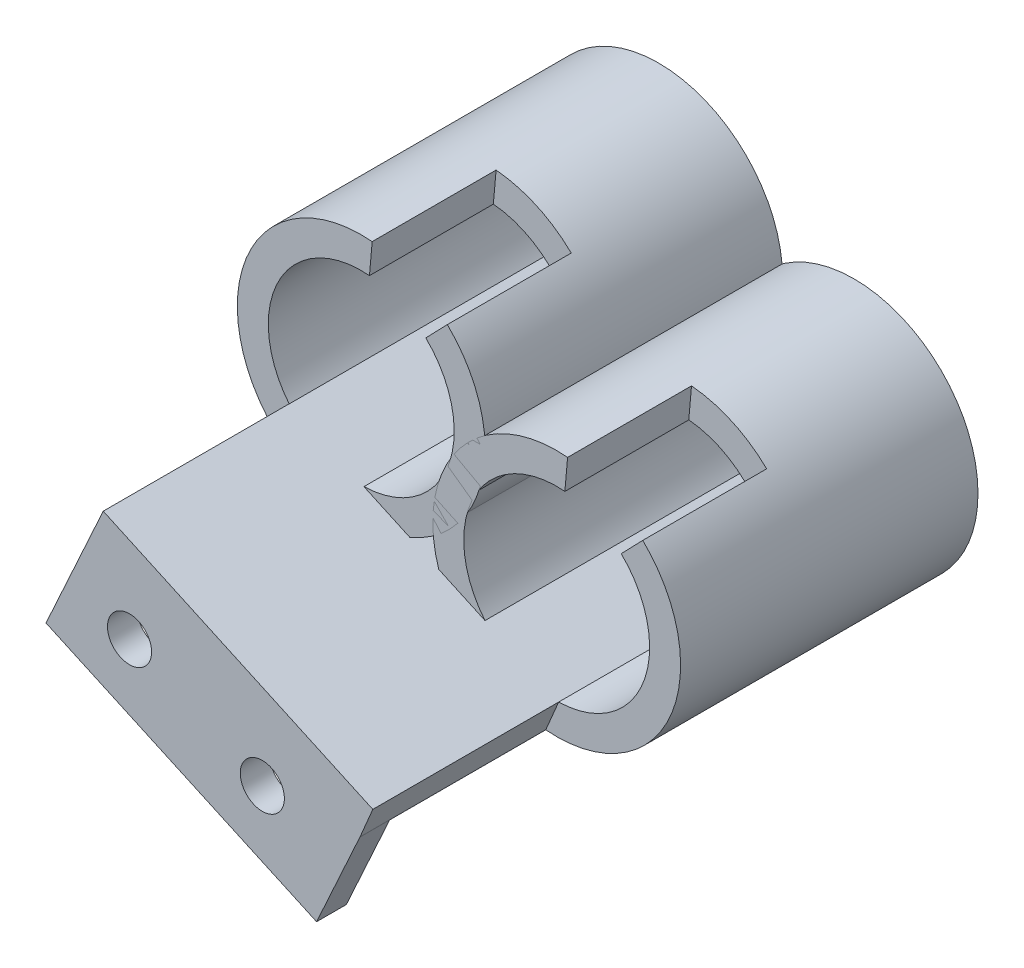
ISO-10303-21;
HEADER;
FILE_DESCRIPTION(('STEP AP214'),'2;1');
FILE_NAME('part.step','',(''),(''),'','','');
FILE_SCHEMA(('AUTOMOTIVE_DESIGN { 1 0 10303 214 1 1 1 1 }'));
ENDSEC;
DATA;
#1=APPLICATION_CONTEXT('core data for automotive mechanical design processes');
#2=APPLICATION_PROTOCOL_DEFINITION('international standard','automotive_design',2000,#1);
#3=PRODUCT_CONTEXT('',#1,'mechanical');
#4=PRODUCT('Part','Part','',(#3));
#5=PRODUCT_RELATED_PRODUCT_CATEGORY('part','',(#4));
#6=PRODUCT_DEFINITION_FORMATION('','',#4);
#7=PRODUCT_DEFINITION_CONTEXT('part definition',#1,'design');
#8=PRODUCT_DEFINITION('design','',#6,#7);
#9=PRODUCT_DEFINITION_SHAPE('','',#8);
#10=(LENGTH_UNIT() NAMED_UNIT(*) SI_UNIT(.MILLI.,.METRE.));
#11=(NAMED_UNIT(*) PLANE_ANGLE_UNIT() SI_UNIT($,.RADIAN.));
#12=(NAMED_UNIT(*) SI_UNIT($,.STERADIAN.) SOLID_ANGLE_UNIT());
#13=UNCERTAINTY_MEASURE_WITH_UNIT(LENGTH_MEASURE(1.E-05),#10,'distance_accuracy_value','');
#14=(GEOMETRIC_REPRESENTATION_CONTEXT(3) GLOBAL_UNCERTAINTY_ASSIGNED_CONTEXT((#13)) GLOBAL_UNIT_ASSIGNED_CONTEXT((#10,
#11,#12)) REPRESENTATION_CONTEXT('',''));
#15=CARTESIAN_POINT('',(0.,0.,0.));
#16=DIRECTION('',(0.,0.,1.));
#17=DIRECTION('',(1.,0.,0.));
#18=AXIS2_PLACEMENT_3D('',#15,#16,#17);
#19=CARTESIAN_POINT('',(15.3328608844258,0.365893564889776,20.9143314535494));
#20=DIRECTION('',(-0.415073445065464,-0.909787906713146,0.));
#21=DIRECTION('',(0.909787906713146,-0.415073445065464,0.));
#22=AXIS2_PLACEMENT_3D('',#19,#20,#21);
#23=PLANE('',#22);
#24=DIRECTION('',(0.,0.,1.));
#25=VECTOR('',#24,1.);
#26=CARTESIAN_POINT('',(15.3328608844258,0.365893564889776,20.9143314535494));
#27=LINE('',#26,#25);
#28=CARTESIAN_POINT('',(15.3328608844258,0.365893564889776,20.9143314535494));
#29=VERTEX_POINT('',#28);
#30=CARTESIAN_POINT('',(15.3328608844258,0.365893564889779,56.1203314535494));
#31=VERTEX_POINT('',#30);
#32=EDGE_CURVE('P0_E11',#29,#31,#27,.T.);
#33=ORIENTED_EDGE('',*,*,#32,.T.);
#34=DIRECTION('',(0.909787906713146,-0.415073445065464,0.));
#35=VECTOR('',#34,1.);
#36=CARTESIAN_POINT('',(-6.50281246817029,10.3280046205645,56.1203314535494));
#37=LINE('',#36,#35);
#38=CARTESIAN_POINT('',(-6.50281246817029,10.3280046205645,56.1203314535494));
#39=VERTEX_POINT('',#38);
#40=EDGE_CURVE('P0_E157',#39,#31,#37,.T.);
#41=ORIENTED_EDGE('',*,*,#40,.F.);
#42=DIRECTION('',(0.,0.,1.));
#43=VECTOR('',#42,1.);
#44=CARTESIAN_POINT('',(-6.50281246817029,10.3280046205645,20.9143314535494));
#45=LINE('',#44,#43);
#46=CARTESIAN_POINT('',(-6.50281246817029,10.3280046205645,20.9143314535494));
#47=VERTEX_POINT('',#46);
#48=EDGE_CURVE('P0_E44',#47,#39,#45,.T.);
#49=ORIENTED_EDGE('',*,*,#48,.F.);
#50=DIRECTION('',(0.909787906713146,-0.415073445065464,0.));
#51=VECTOR('',#50,1.);
#52=CARTESIAN_POINT('',(15.3328608844258,0.365893564889776,20.9143314535494));
#53=LINE('',#52,#51);
#54=EDGE_CURVE('P0_E147',#47,#29,#53,.T.);
#55=ORIENTED_EDGE('',*,*,#54,.T.);
#56=EDGE_LOOP('',(#33,#41,#49,#55));
#57=FACE_BOUND('',#56,.T.);
#58=ADVANCED_FACE('P0_F35',(#57),#23,.T.);
#59=CARTESIAN_POINT('',(15.3328608844258,0.365893564889776,20.9143314535494));
#60=DIRECTION('',(0.908709466234053,-0.41742916282481,0.));
#61=DIRECTION('',(0.41742916282481,0.908709466234053,0.));
#62=AXIS2_PLACEMENT_3D('',#59,#60,#61);
#63=PLANE('',#62);
#64=DIRECTION('',(0.,0.,1.));
#65=VECTOR('',#64,1.);
#66=CARTESIAN_POINT('',(15.3446784619629,0.391619473695926,20.9143314535494));
#67=LINE('',#66,#65);
#68=CARTESIAN_POINT('',(15.3446784619629,0.391619473695926,20.9143314535494));
#69=VERTEX_POINT('',#68);
#70=CARTESIAN_POINT('',(15.3446784619629,0.391619473695926,58.5203314535494));
#71=VERTEX_POINT('',#70);
#72=EDGE_CURVE('P0_E148',#69,#71,#67,.T.);
#73=ORIENTED_EDGE('',*,*,#72,.T.);
#74=DIRECTION('',(0.41742916282481,0.908709466234053,0.));
#75=VECTOR('',#74,1.);
#76=CARTESIAN_POINT('',(15.3328608844258,0.365893564889776,58.5203314535494));
#77=LINE('',#76,#75);
#78=CARTESIAN_POINT('',(15.3328608844258,0.365893564889776,58.5203314535494));
#79=VERTEX_POINT('',#78);
#80=EDGE_CURVE('P0_E121',#79,#71,#77,.T.);
#81=ORIENTED_EDGE('',*,*,#80,.F.);
#82=DIRECTION('',(0.,0.,1.));
#83=VECTOR('',#82,1.);
#84=CARTESIAN_POINT('',(15.3328608844258,0.365893564889779,58.5203314535494));
#85=LINE('',#84,#83);
#86=EDGE_CURVE('P0_E118',#31,#79,#85,.T.);
#87=ORIENTED_EDGE('',*,*,#86,.F.);
#88=ORIENTED_EDGE('',*,*,#32,.F.);
#89=DIRECTION('',(0.41742916282481,0.908709466234053,0.));
#90=VECTOR('',#89,1.);
#91=CARTESIAN_POINT('',(15.3328608844258,0.365893564889776,20.9143314535494));
#92=LINE('',#91,#90);
#93=EDGE_CURVE('P0_E137',#29,#69,#92,.T.);
#94=ORIENTED_EDGE('',*,*,#93,.T.);
#95=EDGE_LOOP('',(#73,#81,#87,#88,#94));
#96=FACE_BOUND('',#95,.T.);
#97=ADVANCED_FACE('P0_F37',(#96),#63,.T.);
#98=CARTESIAN_POINT('',(-6.50281246817029,10.3280046205645,20.9143314535494));
#99=DIRECTION('',(-0.909787906713146,0.415073445065464,0.));
#100=DIRECTION('',(-0.415073445065464,-0.909787906713146,0.));
#101=AXIS2_PLACEMENT_3D('',#98,#99,#100);
#102=PLANE('',#101);
#103=ORIENTED_EDGE('',*,*,#48,.T.);
#104=DIRECTION('',(0.415073445065464,0.909787906713146,0.));
#105=VECTOR('',#104,1.);
#106=CARTESIAN_POINT('',(-9.9977308756215,2.66759044603984,56.1203314535494));
#107=LINE('',#106,#105);
#108=CARTESIAN_POINT('',(-9.9977308756215,2.66759044603984,56.1203314535494));
#109=VERTEX_POINT('',#108);
#110=EDGE_CURVE('P0_E103',#109,#39,#107,.T.);
#111=ORIENTED_EDGE('',*,*,#110,.F.);
#112=DIRECTION('',(0.,0.,-1.));
#113=VECTOR('',#112,1.);
#114=CARTESIAN_POINT('',(-9.9977308756215,2.66759044603984,58.5203314535494));
#115=LINE('',#114,#113);
#116=CARTESIAN_POINT('',(-9.9977308756215,2.66759044603984,58.5203314535494));
#117=VERTEX_POINT('',#116);
#118=EDGE_CURVE('P0_E109',#117,#109,#115,.T.);
#119=ORIENTED_EDGE('',*,*,#118,.F.);
#120=DIRECTION('',(-0.415073445065464,-0.909787906713146,0.));
#121=VECTOR('',#120,1.);
#122=CARTESIAN_POINT('',(-6.50281246817029,10.3280046205645,58.5203314535494));
#123=LINE('',#122,#121);
#124=CARTESIAN_POINT('',(-5.37815341438028,12.7931134307709,58.5203314535494));
#125=VERTEX_POINT('',#124);
#126=EDGE_CURVE('P0_E135',#125,#117,#123,.T.);
#127=ORIENTED_EDGE('',*,*,#126,.F.);
#128=DIRECTION('',(0.,0.,1.));
#129=VECTOR('',#128,1.);
#130=CARTESIAN_POINT('',(-5.37815341438028,12.7931134307709,20.9143314535494));
#131=LINE('',#130,#129);
#132=CARTESIAN_POINT('',(-5.37815341438028,12.7931134307709,20.9143314535494));
#133=VERTEX_POINT('',#132);
#134=EDGE_CURVE('P0_E151',#133,#125,#131,.T.);
#135=ORIENTED_EDGE('',*,*,#134,.F.);
#136=DIRECTION('',(-0.415073445065464,-0.909787906713146,0.));
#137=VECTOR('',#136,1.);
#138=CARTESIAN_POINT('',(-6.50281246817029,10.3280046205645,20.9143314535494));
#139=LINE('',#138,#137);
#140=EDGE_CURVE('P0_E145',#133,#47,#139,.T.);
#141=ORIENTED_EDGE('',*,*,#140,.T.);
#142=EDGE_LOOP('',(#103,#111,#119,#127,#135,#141));
#143=FACE_BOUND('',#142,.T.);
#144=ADVANCED_FACE('P0_F120',(#143),#102,.T.);
#145=CARTESIAN_POINT('',(-5.37815341438028,12.7931134307709,20.9143314535494));
#146=DIRECTION('',(0.416449611726263,0.909158798501695,0.));
#147=DIRECTION('',(-0.909158798501695,0.416449611726263,0.));
#148=AXIS2_PLACEMENT_3D('',#145,#146,#147);
#149=PLANE('',#148);
#150=ORIENTED_EDGE('',*,*,#134,.T.);
#151=DIRECTION('',(-0.909158798501695,0.416449611726263,0.));
#152=VECTOR('',#151,1.);
#153=CARTESIAN_POINT('',(-5.37815341438028,12.7931134307709,58.5203314535494));
#154=LINE('',#153,#152);
#155=CARTESIAN_POINT('',(16.3751761156052,2.82877535094867,58.5203314535494));
#156=VERTEX_POINT('',#155);
#157=EDGE_CURVE('P0_E132',#156,#125,#154,.T.);
#158=ORIENTED_EDGE('',*,*,#157,.F.);
#159=DIRECTION('',(0.,0.,1.));
#160=VECTOR('',#159,1.);
#161=CARTESIAN_POINT('',(16.3751761156052,2.82877535094867,20.9143314535494));
#162=LINE('',#161,#160);
#163=CARTESIAN_POINT('',(16.3751761156052,2.82877535094867,20.9143314535494));
#164=VERTEX_POINT('',#163);
#165=EDGE_CURVE('P0_E153',#164,#156,#162,.T.);
#166=ORIENTED_EDGE('',*,*,#165,.F.);
#167=DIRECTION('',(-0.909158798501695,0.416449611726263,0.));
#168=VECTOR('',#167,1.);
#169=CARTESIAN_POINT('',(-5.37815341438028,12.7931134307709,20.9143314535494));
#170=LINE('',#169,#168);
#171=EDGE_CURVE('P0_E142',#164,#133,#170,.T.);
#172=ORIENTED_EDGE('',*,*,#171,.T.);
#173=EDGE_LOOP('',(#150,#158,#166,#172));
#174=FACE_BOUND('',#173,.T.);
#175=ADVANCED_FACE('P0_F185',(#174),#149,.T.);
#176=CARTESIAN_POINT('',(15.3446784619629,0.391619473695926,20.9143314535494));
#177=DIRECTION('',(0.921049515676657,-0.389445489987746,0.));
#178=DIRECTION('',(0.389445489987746,0.921049515676657,0.));
#179=AXIS2_PLACEMENT_3D('',#176,#177,#178);
#180=PLANE('',#179);
#181=ORIENTED_EDGE('',*,*,#165,.T.);
#182=DIRECTION('',(0.389445489987746,0.921049515676657,0.));
#183=VECTOR('',#182,1.);
#184=CARTESIAN_POINT('',(15.3446784619629,0.391619473695926,58.5203314535494));
#185=LINE('',#184,#183);
#186=EDGE_CURVE('P0_E124',#71,#156,#185,.T.);
#187=ORIENTED_EDGE('',*,*,#186,.F.);
#188=ORIENTED_EDGE('',*,*,#72,.F.);
#189=DIRECTION('',(0.389445489987746,0.921049515676657,0.));
#190=VECTOR('',#189,1.);
#191=CARTESIAN_POINT('',(15.3446784619629,0.391619473695926,20.9143314535494));
#192=LINE('',#191,#190);
#193=EDGE_CURVE('P0_E139',#69,#164,#192,.T.);
#194=ORIENTED_EDGE('',*,*,#193,.T.);
#195=EDGE_LOOP('',(#181,#187,#188,#194));
#196=FACE_BOUND('',#195,.T.);
#197=ADVANCED_FACE('P0_F182',(#196),#180,.T.);
#198=CARTESIAN_POINT('',(0.,0.,20.9143314535494));
#199=DIRECTION('',(0.,0.,-1.));
#200=DIRECTION('',(-1.,0.,0.));
#201=AXIS2_PLACEMENT_3D('',#198,#199,#200);
#202=PLANE('',#201);
#203=ORIENTED_EDGE('',*,*,#93,.F.);
#204=ORIENTED_EDGE('',*,*,#54,.F.);
#205=ORIENTED_EDGE('',*,*,#140,.F.);
#206=ORIENTED_EDGE('',*,*,#171,.F.);
#207=ORIENTED_EDGE('',*,*,#193,.F.);
#208=EDGE_LOOP('',(#203,#204,#205,#206,#207));
#209=FACE_BOUND('',#208,.T.);
#210=ADVANCED_FACE('P0_F190',(#209),#202,.T.);
#211=CARTESIAN_POINT('',(0.,0.,58.5203314535494));
#212=DIRECTION('',(0.,0.,-1.));
#213=DIRECTION('',(-1.,0.,0.));
#214=AXIS2_PLACEMENT_3D('',#211,#212,#213);
#215=PLANE('',#214);
#216=CARTESIAN_POINT('',(-3.25811638908594,4.90169905713775,58.5203314535494));
#217=DIRECTION('',(0.,0.,1.));
#218=DIRECTION('',(1.,0.,0.));
#219=AXIS2_PLACEMENT_3D('',#216,#217,#218);
#220=CIRCLE('',#219,1.78);
#221=CARTESIAN_POINT('',(-1.47811638908594,4.90169905713775,58.5203314535494));
#222=VERTEX_POINT('',#221);
#223=EDGE_CURVE('P0_E167',#222,#222,#220,.T.);
#224=ORIENTED_EDGE('',*,*,#223,.F.);
#225=EDGE_LOOP('',(#224));
#226=FACE_BOUND('',#225,.T.);
#227=CARTESIAN_POINT('',(7.45924455546138,0.0121067725637695,58.5203314535494));
#228=DIRECTION('',(0.,0.,1.));
#229=DIRECTION('',(1.,0.,0.));
#230=AXIS2_PLACEMENT_3D('',#227,#228,#229);
#231=CIRCLE('',#230,1.78);
#232=CARTESIAN_POINT('',(9.23924455546138,0.0121067725637695,58.5203314535494));
#233=VERTEX_POINT('',#232);
#234=EDGE_CURVE('P0_E158',#233,#233,#231,.T.);
#235=ORIENTED_EDGE('',*,*,#234,.F.);
#236=EDGE_LOOP('',(#235));
#237=FACE_BOUND('',#236,.T.);
#238=ORIENTED_EDGE('',*,*,#80,.T.);
#239=ORIENTED_EDGE('',*,*,#186,.T.);
#240=ORIENTED_EDGE('',*,*,#157,.T.);
#241=ORIENTED_EDGE('',*,*,#126,.T.);
#242=DIRECTION('',(-0.909787906713146,0.415073445065464,0.));
#243=VECTOR('',#242,1.);
#244=CARTESIAN_POINT('',(-9.9977308756215,2.66759044603984,58.5203314535494));
#245=LINE('',#244,#243);
#246=CARTESIAN_POINT('',(11.8379424769746,-7.29452060963491,58.5203314535494));
#247=VERTEX_POINT('',#246);
#248=EDGE_CURVE('P0_E115',#247,#117,#245,.T.);
#249=ORIENTED_EDGE('',*,*,#248,.F.);
#250=DIRECTION('',(0.415073445065464,0.909787906713146,0.));
#251=VECTOR('',#250,1.);
#252=CARTESIAN_POINT('',(11.8379424769746,-7.29452060963491,58.5203314535494));
#253=LINE('',#252,#251);
#254=EDGE_CURVE('P0_E126',#247,#79,#253,.T.);
#255=ORIENTED_EDGE('',*,*,#254,.T.);
#256=EDGE_LOOP('',(#238,#239,#240,#241,#249,#255));
#257=FACE_BOUND('',#256,.T.);
#258=ADVANCED_FACE('P0_F175',(#226,#237,#257),#215,.F.);
#259=CARTESIAN_POINT('',(-9.9977308756215,2.66759044603984,56.1203314535494));
#260=DIRECTION('',(0.,0.,1.));
#261=DIRECTION('',(1.,0.,0.));
#262=AXIS2_PLACEMENT_3D('',#259,#260,#261);
#263=PLANE('',#262);
#264=CARTESIAN_POINT('',(-3.25811638908594,4.90169905713775,56.1203314535494));
#265=DIRECTION('',(0.,0.,1.));
#266=DIRECTION('',(1.,0.,0.));
#267=AXIS2_PLACEMENT_3D('',#264,#265,#266);
#268=CIRCLE('',#267,1.78);
#269=CARTESIAN_POINT('',(-1.47811638908594,4.90169905713775,56.1203314535494));
#270=VERTEX_POINT('',#269);
#271=EDGE_CURVE('P0_E39',#270,#270,#268,.T.);
#272=ORIENTED_EDGE('',*,*,#271,.T.);
#273=EDGE_LOOP('',(#272));
#274=FACE_BOUND('',#273,.T.);
#275=CARTESIAN_POINT('',(7.45924455546138,0.0121067725637695,56.1203314535494));
#276=DIRECTION('',(0.,0.,1.));
#277=DIRECTION('',(1.,0.,0.));
#278=AXIS2_PLACEMENT_3D('',#275,#276,#277);
#279=CIRCLE('',#278,1.78);
#280=CARTESIAN_POINT('',(9.23924455546138,0.0121067725637695,56.1203314535494));
#281=VERTEX_POINT('',#280);
#282=EDGE_CURVE('P0_E155',#281,#281,#279,.T.);
#283=ORIENTED_EDGE('',*,*,#282,.T.);
#284=EDGE_LOOP('',(#283));
#285=FACE_BOUND('',#284,.T.);
#286=ORIENTED_EDGE('',*,*,#40,.T.);
#287=DIRECTION('',(0.415073445065464,0.909787906713146,0.));
#288=VECTOR('',#287,1.);
#289=CARTESIAN_POINT('',(11.8379424769746,-7.29452060963491,56.1203314535494));
#290=LINE('',#289,#288);
#291=CARTESIAN_POINT('',(11.8379424769746,-7.29452060963491,56.1203314535494));
#292=VERTEX_POINT('',#291);
#293=EDGE_CURVE('P0_E105',#292,#31,#290,.T.);
#294=ORIENTED_EDGE('',*,*,#293,.F.);
#295=DIRECTION('',(0.909787906713146,-0.415073445065464,0.));
#296=VECTOR('',#295,1.);
#297=CARTESIAN_POINT('',(-9.9977308756215,2.66759044603984,56.1203314535494));
#298=LINE('',#297,#296);
#299=EDGE_CURVE('P0_E99',#109,#292,#298,.T.);
#300=ORIENTED_EDGE('',*,*,#299,.F.);
#301=ORIENTED_EDGE('',*,*,#110,.T.);
#302=EDGE_LOOP('',(#286,#294,#300,#301));
#303=FACE_BOUND('',#302,.T.);
#304=ADVANCED_FACE('P0_F101',(#274,#285,#303),#263,.F.);
#305=CARTESIAN_POINT('',(11.8379424769746,-7.29452060963491,58.5203314535494));
#306=DIRECTION('',(-0.909787906713146,0.415073445065464,0.));
#307=DIRECTION('',(-0.415073445065464,-0.909787906713146,0.));
#308=AXIS2_PLACEMENT_3D('',#305,#306,#307);
#309=PLANE('',#308);
#310=ORIENTED_EDGE('',*,*,#86,.T.);
#311=ORIENTED_EDGE('',*,*,#254,.F.);
#312=DIRECTION('',(0.,0.,1.));
#313=VECTOR('',#312,1.);
#314=CARTESIAN_POINT('',(11.8379424769746,-7.29452060963491,58.5203314535494));
#315=LINE('',#314,#313);
#316=EDGE_CURVE('P0_E108',#292,#247,#315,.T.);
#317=ORIENTED_EDGE('',*,*,#316,.F.);
#318=ORIENTED_EDGE('',*,*,#293,.T.);
#319=EDGE_LOOP('',(#310,#311,#317,#318));
#320=FACE_BOUND('',#319,.T.);
#321=ADVANCED_FACE('P0_F178',(#320),#309,.F.);
#322=CARTESIAN_POINT('',(-0.715109728756649,-1.56742906810891,0.));
#323=DIRECTION('',(-0.415073445065464,-0.909787906713146,0.));
#324=DIRECTION('',(0.909787906713146,-0.415073445065464,0.));
#325=AXIS2_PLACEMENT_3D('',#322,#323,#324);
#326=PLANE('',#325);
#327=ORIENTED_EDGE('',*,*,#118,.T.);
#328=ORIENTED_EDGE('',*,*,#299,.T.);
#329=ORIENTED_EDGE('',*,*,#316,.T.);
#330=ORIENTED_EDGE('',*,*,#248,.T.);
#331=EDGE_LOOP('',(#327,#328,#329,#330));
#332=FACE_BOUND('',#331,.T.);
#333=ADVANCED_FACE('P0_F113',(#332),#326,.T.);
#334=CARTESIAN_POINT('',(7.45924455546138,0.0121067725637695,50.1003314535494));
#335=DIRECTION('',(0.,0.,1.));
#336=DIRECTION('',(1.,0.,0.));
#337=AXIS2_PLACEMENT_3D('',#334,#335,#336);
#338=CYLINDRICAL_SURFACE('',#337,1.78);
#339=ORIENTED_EDGE('',*,*,#234,.T.);
#340=EDGE_LOOP('',(#339));
#341=FACE_BOUND('',#340,.T.);
#342=ORIENTED_EDGE('',*,*,#282,.F.);
#343=EDGE_LOOP('',(#342));
#344=FACE_BOUND('',#343,.T.);
#345=ADVANCED_FACE('P0_F222',(#341,#344),#338,.F.);
#346=CARTESIAN_POINT('',(-3.25811638908594,4.90169905713775,50.1003314535494));
#347=DIRECTION('',(0.,0.,1.));
#348=DIRECTION('',(1.,0.,0.));
#349=AXIS2_PLACEMENT_3D('',#346,#347,#348);
#350=CYLINDRICAL_SURFACE('',#349,1.78);
#351=ORIENTED_EDGE('',*,*,#223,.T.);
#352=EDGE_LOOP('',(#351));
#353=FACE_BOUND('',#352,.T.);
#354=ORIENTED_EDGE('',*,*,#271,.F.);
#355=EDGE_LOOP('',(#354));
#356=FACE_BOUND('',#355,.T.);
#357=ADVANCED_FACE('P0_F225',(#353,#356),#350,.F.);
#358=CLOSED_SHELL('',(#58,#97,#144,#175,#197,#210,#258,#304,#321,#333,#345,#357));
#359=MANIFOLD_SOLID_BREP('P0_B2',#358);
#360=CARTESIAN_POINT('',(16.2135844979987,10.3270343588197,21.5203314535494));
#361=DIRECTION('',(0.,0.,-1.));
#362=DIRECTION('',(-1.,0.,0.));
#363=AXIS2_PLACEMENT_3D('',#360,#361,#362);
#364=CYLINDRICAL_SURFACE('',#363,3.285);
#365=CARTESIAN_POINT('',(16.2135844979987,10.3270343588197,21.5203314535494));
#366=DIRECTION('',(0.,0.,1.));
#367=DIRECTION('',(1.,0.,0.));
#368=AXIS2_PLACEMENT_3D('',#365,#366,#367);
#369=CIRCLE('',#368,3.285);
#370=CARTESIAN_POINT('',(19.4985844979987,10.3270343588197,21.5203314535494));
#371=VERTEX_POINT('',#370);
#372=EDGE_CURVE('P1_E13',#371,#371,#369,.T.);
#373=ORIENTED_EDGE('',*,*,#372,.T.);
#374=EDGE_LOOP('',(#373));
#375=FACE_BOUND('',#374,.T.);
#376=CARTESIAN_POINT('',(16.2135844979987,10.3270343588197,19.5203314535494));
#377=DIRECTION('',(0.,0.,1.));
#378=DIRECTION('',(1.,0.,0.));
#379=AXIS2_PLACEMENT_3D('',#376,#377,#378);
#380=CIRCLE('',#379,3.285);
#381=CARTESIAN_POINT('',(19.4985844979987,10.3270343588197,19.5203314535494));
#382=VERTEX_POINT('',#381);
#383=EDGE_CURVE('P1_E30',#382,#382,#380,.T.);
#384=ORIENTED_EDGE('',*,*,#383,.F.);
#385=EDGE_LOOP('',(#384));
#386=FACE_BOUND('',#385,.T.);
#387=ADVANCED_FACE('P1_F24',(#375,#386),#364,.F.);
#388=CARTESIAN_POINT('',(16.2135844979987,10.3270343588197,19.5203314535494));
#389=DIRECTION('',(0.,0.,1.));
#390=DIRECTION('',(1.,0.,0.));
#391=AXIS2_PLACEMENT_3D('',#388,#389,#390);
#392=PLANE('',#391);
#393=ORIENTED_EDGE('',*,*,#383,.T.);
#394=EDGE_LOOP('',(#393));
#395=FACE_BOUND('',#394,.T.);
#396=CARTESIAN_POINT('',(16.2135844979987,10.3270343588197,19.5203314535494));
#397=DIRECTION('',(0.,0.,1.));
#398=DIRECTION('',(1.,0.,0.));
#399=AXIS2_PLACEMENT_3D('',#396,#397,#398);
#400=CIRCLE('',#399,10.);
#401=CARTESIAN_POINT('',(26.2135844979987,10.3270343588197,19.5203314535494));
#402=VERTEX_POINT('',#401);
#403=EDGE_CURVE('P1_E149',#402,#402,#400,.T.);
#404=ORIENTED_EDGE('',*,*,#403,.F.);
#405=EDGE_LOOP('',(#404));
#406=FACE_BOUND('',#405,.T.);
#407=ADVANCED_FACE('P1_F168',(#395,#406),#392,.F.);
#408=CARTESIAN_POINT('',(16.2135844979987,10.3270343588197,43.5203314535494));
#409=DIRECTION('',(0.996114079392994,-0.0880723613572865,0.));
#410=DIRECTION('',(0.0880723613572865,0.996114079392994,0.));
#411=AXIS2_PLACEMENT_3D('',#408,#409,#410);
#412=PLANE('',#411);
#413=DIRECTION('',(-0.0880723613572865,-0.996114079392994,0.));
#414=VECTOR('',#413,1.);
#415=CARTESIAN_POINT('',(16.2135844979987,10.3270343588197,33.5203314535494));
#416=LINE('',#415,#414);
#417=CARTESIAN_POINT('',(15.553041787819,2.85617876337226,33.5203314535494));
#418=VERTEX_POINT('',#417);
#419=CARTESIAN_POINT('',(15.3328608844258,0.365893564889776,33.5203314535494));
#420=VERTEX_POINT('',#419);
#421=EDGE_CURVE('P1_E136',#418,#420,#416,.T.);
#422=ORIENTED_EDGE('',*,*,#421,.T.);
#423=DIRECTION('',(0.,0.,-1.));
#424=VECTOR('',#423,1.);
#425=CARTESIAN_POINT('',(15.3328608844258,0.365893564889776,43.5203314535494));
#426=LINE('',#425,#424);
#427=CARTESIAN_POINT('',(15.3328608844258,0.365893564889776,43.5203314535494));
#428=VERTEX_POINT('',#427);
#429=EDGE_CURVE('P1_E105',#428,#420,#426,.T.);
#430=ORIENTED_EDGE('',*,*,#429,.F.);
#431=DIRECTION('',(-0.0880723613572865,-0.996114079392994,0.));
#432=VECTOR('',#431,1.);
#433=CARTESIAN_POINT('',(16.2135844979987,10.3270343588197,43.5203314535494));
#434=LINE('',#433,#432);
#435=CARTESIAN_POINT('',(15.553041787819,2.85617876337226,43.5203314535494));
#436=VERTEX_POINT('',#435);
#437=EDGE_CURVE('P1_E88',#436,#428,#434,.T.);
#438=ORIENTED_EDGE('',*,*,#437,.F.);
#439=DIRECTION('',(0.,0.,-1.));
#440=VECTOR('',#439,1.);
#441=CARTESIAN_POINT('',(15.553041787819,2.85617876337226,43.5203314535494));
#442=LINE('',#441,#440);
#443=EDGE_CURVE('P1_E102',#436,#418,#442,.T.);
#444=ORIENTED_EDGE('',*,*,#443,.T.);
#445=EDGE_LOOP('',(#422,#430,#438,#444));
#446=FACE_BOUND('',#445,.T.);
#447=ADVANCED_FACE('P1_F101',(#446),#412,.F.);
#448=CARTESIAN_POINT('',(16.2135844979987,10.3270343588197,43.5203314535494));
#449=DIRECTION('',(-0.719398449349351,0.694597632499383,0.));
#450=DIRECTION('',(-0.694597632499383,-0.719398449349351,0.));
#451=AXIS2_PLACEMENT_3D('',#448,#449,#450);
#452=PLANE('',#451);
#453=DIRECTION('',(0.694597632499383,0.719398449349351,0.));
#454=VECTOR('',#453,1.);
#455=CARTESIAN_POINT('',(16.2135844979987,10.3270343588197,33.5203314535494));
#456=LINE('',#455,#454);
#457=CARTESIAN_POINT('',(21.4230667417441,15.7225227289398,33.5203314535494));
#458=VERTEX_POINT('',#457);
#459=CARTESIAN_POINT('',(23.1595608229925,17.5210188523132,33.5203314535494));
#460=VERTEX_POINT('',#459);
#461=EDGE_CURVE('P1_E161',#458,#460,#456,.T.);
#462=ORIENTED_EDGE('',*,*,#461,.F.);
#463=DIRECTION('',(0.,0.,-1.));
#464=VECTOR('',#463,1.);
#465=CARTESIAN_POINT('',(21.4230667417441,15.7225227289398,43.5203314535494));
#466=LINE('',#465,#464);
#467=CARTESIAN_POINT('',(21.4230667417441,15.7225227289398,43.5203314535494));
#468=VERTEX_POINT('',#467);
#469=EDGE_CURVE('P1_E112',#468,#458,#466,.T.);
#470=ORIENTED_EDGE('',*,*,#469,.F.);
#471=DIRECTION('',(0.694597632499383,0.719398449349351,0.));
#472=VECTOR('',#471,1.);
#473=CARTESIAN_POINT('',(16.2135844979987,10.3270343588197,43.5203314535494));
#474=LINE('',#473,#472);
#475=CARTESIAN_POINT('',(23.1595608229925,17.5210188523132,43.5203314535494));
#476=VERTEX_POINT('',#475);
#477=EDGE_CURVE('P1_E91',#468,#476,#474,.T.);
#478=ORIENTED_EDGE('',*,*,#477,.T.);
#479=DIRECTION('',(0.,0.,-1.));
#480=VECTOR('',#479,1.);
#481=CARTESIAN_POINT('',(23.1595608229925,17.5210188523132,43.5203314535494));
#482=LINE('',#481,#480);
#483=EDGE_CURVE('P1_E144',#476,#460,#482,.T.);
#484=ORIENTED_EDGE('',*,*,#483,.T.);
#485=EDGE_LOOP('',(#462,#470,#478,#484));
#486=FACE_BOUND('',#485,.T.);
#487=ADVANCED_FACE('P1_F181',(#486),#452,.T.);
#488=CARTESIAN_POINT('',(16.2135844979987,10.3270343588197,33.5203314535494));
#489=DIRECTION('',(0.,0.,1.));
#490=DIRECTION('',(1.,0.,0.));
#491=AXIS2_PLACEMENT_3D('',#488,#489,#490);
#492=PLANE('',#491);
#493=ORIENTED_EDGE('',*,*,#461,.T.);
#494=CARTESIAN_POINT('',(16.2135844979987,10.3270343588197,33.5203314535494));
#495=DIRECTION('',(0.,0.,1.));
#496=DIRECTION('',(1.,0.,0.));
#497=AXIS2_PLACEMENT_3D('',#494,#495,#496);
#498=CIRCLE('',#497,10.);
#499=CARTESIAN_POINT('',(17.0943081115716,20.2881751527497,33.5203314535494));
#500=VERTEX_POINT('',#499);
#501=EDGE_CURVE('P1_E37',#460,#500,#498,.T.);
#502=ORIENTED_EDGE('',*,*,#501,.T.);
#503=DIRECTION('',(0.0880723613572865,0.996114079392994,0.));
#504=VECTOR('',#503,1.);
#505=CARTESIAN_POINT('',(16.2135844979987,10.3270343588197,33.5203314535494));
#506=LINE('',#505,#504);
#507=CARTESIAN_POINT('',(16.8741272081783,17.7978899542672,33.5203314535494));
#508=VERTEX_POINT('',#507);
#509=EDGE_CURVE('P1_E158',#508,#500,#506,.T.);
#510=ORIENTED_EDGE('',*,*,#509,.F.);
#511=CARTESIAN_POINT('',(16.2135844979987,10.3270343588197,33.5203314535494));
#512=DIRECTION('',(0.,0.,1.));
#513=DIRECTION('',(1.,0.,0.));
#514=AXIS2_PLACEMENT_3D('',#511,#512,#513);
#515=CIRCLE('',#514,7.5);
#516=EDGE_CURVE('P1_E114',#458,#508,#515,.T.);
#517=ORIENTED_EDGE('',*,*,#516,.F.);
#518=EDGE_LOOP('',(#493,#502,#510,#517));
#519=FACE_BOUND('',#518,.T.);
#520=ADVANCED_FACE('P1_F186',(#519),#492,.T.);
#521=CARTESIAN_POINT('',(16.2135844979987,10.3270343588197,43.5203314535494));
#522=DIRECTION('',(-0.996114079392994,0.0880723613572865,0.));
#523=DIRECTION('',(-0.0880723613572865,-0.996114079392994,0.));
#524=AXIS2_PLACEMENT_3D('',#521,#522,#523);
#525=PLANE('',#524);
#526=ORIENTED_EDGE('',*,*,#509,.T.);
#527=DIRECTION('',(0.,0.,-1.));
#528=VECTOR('',#527,1.);
#529=CARTESIAN_POINT('',(17.0943081115716,20.2881751527497,43.5203314535494));
#530=LINE('',#529,#528);
#531=CARTESIAN_POINT('',(17.0943081115716,20.2881751527497,43.5203314535494));
#532=VERTEX_POINT('',#531);
#533=EDGE_CURVE('P1_E42',#532,#500,#530,.T.);
#534=ORIENTED_EDGE('',*,*,#533,.F.);
#535=DIRECTION('',(0.0880723613572865,0.996114079392994,0.));
#536=VECTOR('',#535,1.);
#537=CARTESIAN_POINT('',(16.2135844979987,10.3270343588197,43.5203314535494));
#538=LINE('',#537,#536);
#539=CARTESIAN_POINT('',(16.8741272081783,17.7978899542672,43.5203314535494));
#540=VERTEX_POINT('',#539);
#541=EDGE_CURVE('P1_E155',#540,#532,#538,.T.);
#542=ORIENTED_EDGE('',*,*,#541,.F.);
#543=DIRECTION('',(0.,0.,-1.));
#544=VECTOR('',#543,1.);
#545=CARTESIAN_POINT('',(16.8741272081783,17.7978899542672,43.5203314535494));
#546=LINE('',#545,#544);
#547=EDGE_CURVE('P1_E122',#540,#508,#546,.T.);
#548=ORIENTED_EDGE('',*,*,#547,.T.);
#549=EDGE_LOOP('',(#526,#534,#542,#548));
#550=FACE_BOUND('',#549,.T.);
#551=ADVANCED_FACE('P1_F188',(#550),#525,.F.);
#552=CARTESIAN_POINT('',(16.2135844979987,10.3270343588197,43.5203314535494));
#553=DIRECTION('',(0.,0.,1.));
#554=DIRECTION('',(1.,0.,0.));
#555=AXIS2_PLACEMENT_3D('',#552,#553,#554);
#556=PLANE('',#555);
#557=CARTESIAN_POINT('',(16.2135844979987,10.3270343588197,43.5203314535494));
#558=DIRECTION('',(0.,0.,1.));
#559=DIRECTION('',(1.,0.,0.));
#560=AXIS2_PLACEMENT_3D('',#557,#558,#559);
#561=CIRCLE('',#560,7.5);
#562=CARTESIAN_POINT('',(11.0041022542533,4.93154598869958,43.5203314535494));
#563=VERTEX_POINT('',#562);
#564=EDGE_CURVE('P1_E125',#563,#540,#561,.F.);
#565=ORIENTED_EDGE('',*,*,#564,.T.);
#566=ORIENTED_EDGE('',*,*,#541,.T.);
#567=CARTESIAN_POINT('',(16.2135844979987,10.3270343588197,43.5203314535494));
#568=DIRECTION('',(0.,0.,1.));
#569=DIRECTION('',(1.,0.,0.));
#570=AXIS2_PLACEMENT_3D('',#567,#568,#569);
#571=CIRCLE('',#570,10.);
#572=CARTESIAN_POINT('',(9.26760817300485,3.1330498653262,43.5203314535494));
#573=VERTEX_POINT('',#572);
#574=EDGE_CURVE('P1_E333',#532,#573,#571,.T.);
#575=ORIENTED_EDGE('',*,*,#574,.T.);
#576=DIRECTION('',(0.694597632499383,0.719398449349352,0.));
#577=VECTOR('',#576,1.);
#578=CARTESIAN_POINT('',(16.2135844979987,10.3270343588197,43.5203314535494));
#579=LINE('',#578,#577);
#580=EDGE_CURVE('P1_E152',#573,#563,#579,.T.);
#581=ORIENTED_EDGE('',*,*,#580,.T.);
#582=EDGE_LOOP('',(#565,#566,#575,#581));
#583=FACE_BOUND('',#582,.T.);
#584=ADVANCED_FACE('P1_F191',(#583),#556,.T.);
#585=CARTESIAN_POINT('',(16.2135844979987,10.3270343588197,43.5203314535494));
#586=DIRECTION('',(-0.719398449349352,0.694597632499383,0.));
#587=DIRECTION('',(-0.694597632499383,-0.719398449349352,0.));
#588=AXIS2_PLACEMENT_3D('',#585,#586,#587);
#589=PLANE('',#588);
#590=DIRECTION('',(0.694597632499383,0.719398449349352,0.));
#591=VECTOR('',#590,1.);
#592=CARTESIAN_POINT('',(16.2135844979987,10.3270343588197,33.5203314535494));
#593=LINE('',#592,#591);
#594=CARTESIAN_POINT('',(9.26760817300485,3.1330498653262,33.5203314535494));
#595=VERTEX_POINT('',#594);
#596=CARTESIAN_POINT('',(11.0041022542533,4.93154598869958,33.5203314535494));
#597=VERTEX_POINT('',#596);
#598=EDGE_CURVE('P1_E330',#595,#597,#593,.T.);
#599=ORIENTED_EDGE('',*,*,#598,.T.);
#600=DIRECTION('',(0.,0.,-1.));
#601=VECTOR('',#600,1.);
#602=CARTESIAN_POINT('',(11.0041022542533,4.93154598869958,43.5203314535494));
#603=LINE('',#602,#601);
#604=EDGE_CURVE('P1_E130',#563,#597,#603,.T.);
#605=ORIENTED_EDGE('',*,*,#604,.F.);
#606=ORIENTED_EDGE('',*,*,#580,.F.);
#607=DIRECTION('',(0.,0.,-1.));
#608=VECTOR('',#607,1.);
#609=CARTESIAN_POINT('',(9.26760817300485,3.1330498653262,43.5203314535494));
#610=LINE('',#609,#608);
#611=EDGE_CURVE('P1_E327',#573,#595,#610,.T.);
#612=ORIENTED_EDGE('',*,*,#611,.T.);
#613=EDGE_LOOP('',(#599,#605,#606,#612));
#614=FACE_BOUND('',#613,.T.);
#615=ADVANCED_FACE('P1_F195',(#614),#589,.F.);
#616=CARTESIAN_POINT('',(16.2135844979987,10.3270343588197,33.5203314535494));
#617=DIRECTION('',(0.,0.,-1.));
#618=DIRECTION('',(-1.,0.,0.));
#619=AXIS2_PLACEMENT_3D('',#616,#617,#618);
#620=CYLINDRICAL_SURFACE('',#619,10.);
#621=EDGE_CURVE('P1_E132',#595,#420,#498,.T.);
#622=ORIENTED_EDGE('',*,*,#621,.F.);
#623=ORIENTED_EDGE('',*,*,#611,.F.);
#624=ORIENTED_EDGE('',*,*,#574,.F.);
#625=ORIENTED_EDGE('',*,*,#533,.T.);
#626=ORIENTED_EDGE('',*,*,#501,.F.);
#627=ORIENTED_EDGE('',*,*,#483,.F.);
#628=CARTESIAN_POINT('',(16.2135844979987,10.3270343588197,43.5203314535494));
#629=DIRECTION('',(0.,0.,1.));
#630=DIRECTION('',(1.,0.,0.));
#631=AXIS2_PLACEMENT_3D('',#628,#629,#630);
#632=CIRCLE('',#631,10.);
#633=EDGE_CURVE('P1_E107',#428,#476,#632,.T.);
#634=ORIENTED_EDGE('',*,*,#633,.F.);
#635=ORIENTED_EDGE('',*,*,#429,.T.);
#636=EDGE_LOOP('',(#622,#623,#624,#625,#626,#627,#634,#635));
#637=FACE_BOUND('',#636,.T.);
#638=ORIENTED_EDGE('',*,*,#403,.T.);
#639=EDGE_LOOP('',(#638));
#640=FACE_BOUND('',#639,.T.);
#641=ADVANCED_FACE('P1_F199',(#637,#640),#620,.T.);
#642=ORIENTED_EDGE('',*,*,#621,.T.);
#643=ORIENTED_EDGE('',*,*,#421,.F.);
#644=EDGE_CURVE('P1_E111',#597,#418,#515,.T.);
#645=ORIENTED_EDGE('',*,*,#644,.F.);
#646=ORIENTED_EDGE('',*,*,#598,.F.);
#647=EDGE_LOOP('',(#642,#643,#645,#646));
#648=FACE_BOUND('',#647,.T.);
#649=ADVANCED_FACE('P1_F203',(#648),#492,.T.);
#650=CARTESIAN_POINT('',(16.2135844979987,10.3270343588197,33.5203314535494));
#651=DIRECTION('',(0.,0.,-1.));
#652=DIRECTION('',(-1.,0.,0.));
#653=AXIS2_PLACEMENT_3D('',#650,#651,#652);
#654=CYLINDRICAL_SURFACE('',#653,7.5);
#655=CARTESIAN_POINT('',(16.2135844979987,10.3270343588197,21.5203314535494));
#656=DIRECTION('',(0.,0.,1.));
#657=DIRECTION('',(1.,0.,0.));
#658=AXIS2_PLACEMENT_3D('',#655,#656,#657);
#659=CIRCLE('',#658,7.5);
#660=CARTESIAN_POINT('',(23.7135844979987,10.3270343588197,21.5203314535494));
#661=VERTEX_POINT('',#660);
#662=EDGE_CURVE('P1_E116',#661,#661,#659,.F.);
#663=ORIENTED_EDGE('',*,*,#662,.T.);
#664=EDGE_LOOP('',(#663));
#665=FACE_BOUND('',#664,.T.);
#666=ORIENTED_EDGE('',*,*,#644,.T.);
#667=ORIENTED_EDGE('',*,*,#443,.F.);
#668=CARTESIAN_POINT('',(16.2135844979987,10.3270343588197,43.5203314535494));
#669=DIRECTION('',(0.,0.,1.));
#670=DIRECTION('',(1.,0.,0.));
#671=AXIS2_PLACEMENT_3D('',#668,#669,#670);
#672=CIRCLE('',#671,7.5);
#673=EDGE_CURVE('P1_E85',#468,#436,#672,.F.);
#674=ORIENTED_EDGE('',*,*,#673,.F.);
#675=ORIENTED_EDGE('',*,*,#469,.T.);
#676=ORIENTED_EDGE('',*,*,#516,.T.);
#677=ORIENTED_EDGE('',*,*,#547,.F.);
#678=ORIENTED_EDGE('',*,*,#564,.F.);
#679=ORIENTED_EDGE('',*,*,#604,.T.);
#680=EDGE_LOOP('',(#666,#667,#674,#675,#676,#677,#678,#679));
#681=FACE_BOUND('',#680,.T.);
#682=ADVANCED_FACE('P1_F109',(#665,#681),#654,.F.);
#683=CARTESIAN_POINT('',(16.2135844979987,10.3270343588197,43.5203314535494));
#684=DIRECTION('',(0.,0.,1.));
#685=DIRECTION('',(1.,0.,0.));
#686=AXIS2_PLACEMENT_3D('',#683,#684,#685);
#687=PLANE('',#686);
#688=ORIENTED_EDGE('',*,*,#673,.T.);
#689=ORIENTED_EDGE('',*,*,#437,.T.);
#690=ORIENTED_EDGE('',*,*,#633,.T.);
#691=ORIENTED_EDGE('',*,*,#477,.F.);
#692=EDGE_LOOP('',(#688,#689,#690,#691));
#693=FACE_BOUND('',#692,.T.);
#694=ADVANCED_FACE('P1_F87',(#693),#687,.T.);
#695=OPEN_SHELL('',(#387,#407,#447,#487,#520,#551,#584,#615,#641,#649,#682,#694));
#696=SHELL_BASED_SURFACE_MODEL('P1_B1',(#695));
#697=CARTESIAN_POINT('',(0.443163856823544,17.521989114058,21.5203314535494));
#698=DIRECTION('',(0.,0.,-1.));
#699=DIRECTION('',(-1.,0.,0.));
#700=AXIS2_PLACEMENT_3D('',#697,#698,#699);
#701=CYLINDRICAL_SURFACE('',#700,3.285);
#702=CARTESIAN_POINT('',(0.443163856823544,17.521989114058,21.5203314535494));
#703=DIRECTION('',(0.,0.,1.));
#704=DIRECTION('',(1.,0.,0.));
#705=AXIS2_PLACEMENT_3D('',#702,#703,#704);
#706=CIRCLE('',#705,3.285);
#707=CARTESIAN_POINT('',(3.72816385682354,17.521989114058,21.5203314535494));
#708=VERTEX_POINT('',#707);
#709=EDGE_CURVE('P2_E13',#708,#708,#706,.T.);
#710=ORIENTED_EDGE('',*,*,#709,.T.);
#711=EDGE_LOOP('',(#710));
#712=FACE_BOUND('',#711,.T.);
#713=CARTESIAN_POINT('',(0.443163856823544,17.521989114058,19.5203314535494));
#714=DIRECTION('',(0.,0.,1.));
#715=DIRECTION('',(1.,0.,0.));
#716=AXIS2_PLACEMENT_3D('',#713,#714,#715);
#717=CIRCLE('',#716,3.285);
#718=CARTESIAN_POINT('',(3.72816385682354,17.521989114058,19.5203314535494));
#719=VERTEX_POINT('',#718);
#720=EDGE_CURVE('P2_E30',#719,#719,#717,.T.);
#721=ORIENTED_EDGE('',*,*,#720,.F.);
#722=EDGE_LOOP('',(#721));
#723=FACE_BOUND('',#722,.T.);
#724=ADVANCED_FACE('P2_F24',(#712,#723),#701,.F.);
#725=CARTESIAN_POINT('',(0.443163856823544,17.521989114058,19.5203314535494));
#726=DIRECTION('',(0.,0.,1.));
#727=DIRECTION('',(1.,0.,0.));
#728=AXIS2_PLACEMENT_3D('',#725,#726,#727);
#729=PLANE('',#728);
#730=ORIENTED_EDGE('',*,*,#720,.T.);
#731=EDGE_LOOP('',(#730));
#732=FACE_BOUND('',#731,.T.);
#733=CARTESIAN_POINT('',(0.443163856823544,17.521989114058,19.5203314535494));
#734=DIRECTION('',(0.,0.,1.));
#735=DIRECTION('',(1.,0.,0.));
#736=AXIS2_PLACEMENT_3D('',#733,#734,#735);
#737=CIRCLE('',#736,10.);
#738=CARTESIAN_POINT('',(10.4431638568235,17.521989114058,19.5203314535494));
#739=VERTEX_POINT('',#738);
#740=EDGE_CURVE('P2_E147',#739,#739,#737,.T.);
#741=ORIENTED_EDGE('',*,*,#740,.F.);
#742=EDGE_LOOP('',(#741));
#743=FACE_BOUND('',#742,.T.);
#744=ADVANCED_FACE('P2_F166',(#732,#743),#729,.F.);
#745=CARTESIAN_POINT('',(0.443163856823544,17.521989114058,43.5203314535494));
#746=DIRECTION('',(0.996114079392994,-0.0880723613572865,0.));
#747=DIRECTION('',(0.0880723613572865,0.996114079392994,0.));
#748=AXIS2_PLACEMENT_3D('',#745,#746,#747);
#749=PLANE('',#748);
#750=DIRECTION('',(-0.0880723613572865,-0.996114079392994,0.));
#751=VECTOR('',#750,1.);
#752=CARTESIAN_POINT('',(0.443163856823544,17.521989114058,33.5203314535494));
#753=LINE('',#752,#751);
#754=CARTESIAN_POINT('',(-0.217378853356104,10.0511335186106,33.5203314535494));
#755=VERTEX_POINT('',#754);
#756=CARTESIAN_POINT('',(-0.437559756749321,7.56084832012811,33.5203314535494));
#757=VERTEX_POINT('',#756);
#758=EDGE_CURVE('P2_E134',#755,#757,#753,.T.);
#759=ORIENTED_EDGE('',*,*,#758,.T.);
#760=DIRECTION('',(0.,0.,-1.));
#761=VECTOR('',#760,1.);
#762=CARTESIAN_POINT('',(-0.437559756749321,7.56084832012811,43.5203314535494));
#763=LINE('',#762,#761);
#764=CARTESIAN_POINT('',(-0.437559756749321,7.56084832012811,43.5203314535494));
#765=VERTEX_POINT('',#764);
#766=EDGE_CURVE('P2_E104',#765,#757,#763,.T.);
#767=ORIENTED_EDGE('',*,*,#766,.F.);
#768=DIRECTION('',(-0.0880723613572865,-0.996114079392994,0.));
#769=VECTOR('',#768,1.);
#770=CARTESIAN_POINT('',(0.443163856823544,17.521989114058,43.5203314535494));
#771=LINE('',#770,#769);
#772=CARTESIAN_POINT('',(-0.217378853356104,10.0511335186106,43.5203314535494));
#773=VERTEX_POINT('',#772);
#774=EDGE_CURVE('P2_E88',#773,#765,#771,.T.);
#775=ORIENTED_EDGE('',*,*,#774,.F.);
#776=DIRECTION('',(0.,0.,-1.));
#777=VECTOR('',#776,1.);
#778=CARTESIAN_POINT('',(-0.217378853356104,10.0511335186106,43.5203314535494));
#779=LINE('',#778,#777);
#780=EDGE_CURVE('P2_E101',#773,#755,#779,.T.);
#781=ORIENTED_EDGE('',*,*,#780,.T.);
#782=EDGE_LOOP('',(#759,#767,#775,#781));
#783=FACE_BOUND('',#782,.T.);
#784=ADVANCED_FACE('P2_F100',(#783),#749,.F.);
#785=CARTESIAN_POINT('',(0.443163856823546,17.521989114058,43.5203314535494));
#786=DIRECTION('',(-0.719398449349351,0.694597632499383,0.));
#787=DIRECTION('',(-0.694597632499383,-0.719398449349351,0.));
#788=AXIS2_PLACEMENT_3D('',#785,#786,#787);
#789=PLANE('',#788);
#790=DIRECTION('',(0.694597632499383,0.719398449349351,0.));
#791=VECTOR('',#790,1.);
#792=CARTESIAN_POINT('',(0.443163856823546,17.521989114058,33.5203314535494));
#793=LINE('',#792,#791);
#794=CARTESIAN_POINT('',(5.65264610056892,22.9174774841782,33.5203314535494));
#795=VERTEX_POINT('',#794);
#796=CARTESIAN_POINT('',(7.38914018181738,24.7159736075516,33.5203314535494));
#797=VERTEX_POINT('',#796);
#798=EDGE_CURVE('P2_E159',#795,#797,#793,.T.);
#799=ORIENTED_EDGE('',*,*,#798,.F.);
#800=DIRECTION('',(0.,0.,-1.));
#801=VECTOR('',#800,1.);
#802=CARTESIAN_POINT('',(5.65264610056892,22.9174774841782,43.5203314535494));
#803=LINE('',#802,#801);
#804=CARTESIAN_POINT('',(5.65264610056892,22.9174774841782,43.5203314535494));
#805=VERTEX_POINT('',#804);
#806=EDGE_CURVE('P2_E110',#805,#795,#803,.T.);
#807=ORIENTED_EDGE('',*,*,#806,.F.);
#808=DIRECTION('',(0.694597632499383,0.719398449349351,0.));
#809=VECTOR('',#808,1.);
#810=CARTESIAN_POINT('',(0.443163856823546,17.521989114058,43.5203314535494));
#811=LINE('',#810,#809);
#812=CARTESIAN_POINT('',(7.38914018181738,24.7159736075516,43.5203314535494));
#813=VERTEX_POINT('',#812);
#814=EDGE_CURVE('P2_E91',#805,#813,#811,.T.);
#815=ORIENTED_EDGE('',*,*,#814,.T.);
#816=DIRECTION('',(0.,0.,-1.));
#817=VECTOR('',#816,1.);
#818=CARTESIAN_POINT('',(7.38914018181738,24.7159736075516,43.5203314535494));
#819=LINE('',#818,#817);
#820=EDGE_CURVE('P2_E142',#813,#797,#819,.T.);
#821=ORIENTED_EDGE('',*,*,#820,.T.);
#822=EDGE_LOOP('',(#799,#807,#815,#821));
#823=FACE_BOUND('',#822,.T.);
#824=ADVANCED_FACE('P2_F179',(#823),#789,.T.);
#825=CARTESIAN_POINT('',(0.443163856823544,17.521989114058,33.5203314535494));
#826=DIRECTION('',(0.,0.,1.));
#827=DIRECTION('',(1.,0.,0.));
#828=AXIS2_PLACEMENT_3D('',#825,#826,#827);
#829=PLANE('',#828);
#830=ORIENTED_EDGE('',*,*,#798,.T.);
#831=CARTESIAN_POINT('',(0.443163856823544,17.521989114058,33.5203314535494));
#832=DIRECTION('',(0.,0.,1.));
#833=DIRECTION('',(1.,0.,0.));
#834=AXIS2_PLACEMENT_3D('',#831,#832,#833);
#835=CIRCLE('',#834,10.);
#836=CARTESIAN_POINT('',(1.32388747039641,27.483129907988,33.5203314535494));
#837=VERTEX_POINT('',#836);
#838=EDGE_CURVE('P2_E37',#797,#837,#835,.T.);
#839=ORIENTED_EDGE('',*,*,#838,.T.);
#840=DIRECTION('',(0.0880723613572865,0.996114079392994,0.));
#841=VECTOR('',#840,1.);
#842=CARTESIAN_POINT('',(0.443163856823545,17.521989114058,33.5203314535494));
#843=LINE('',#842,#841);
#844=CARTESIAN_POINT('',(1.10370656700319,24.9928447095055,33.5203314535494));
#845=VERTEX_POINT('',#844);
#846=EDGE_CURVE('P2_E156',#845,#837,#843,.T.);
#847=ORIENTED_EDGE('',*,*,#846,.F.);
#848=CARTESIAN_POINT('',(0.443163856823544,17.521989114058,33.5203314535494));
#849=DIRECTION('',(0.,0.,1.));
#850=DIRECTION('',(1.,0.,0.));
#851=AXIS2_PLACEMENT_3D('',#848,#849,#850);
#852=CIRCLE('',#851,7.5);
#853=EDGE_CURVE('P2_E112',#795,#845,#852,.T.);
#854=ORIENTED_EDGE('',*,*,#853,.F.);
#855=EDGE_LOOP('',(#830,#839,#847,#854));
#856=FACE_BOUND('',#855,.T.);
#857=ADVANCED_FACE('P2_F184',(#856),#829,.T.);
#858=CARTESIAN_POINT('',(0.443163856823545,17.521989114058,43.5203314535494));
#859=DIRECTION('',(-0.996114079392994,0.0880723613572865,0.));
#860=DIRECTION('',(-0.0880723613572865,-0.996114079392994,0.));
#861=AXIS2_PLACEMENT_3D('',#858,#859,#860);
#862=PLANE('',#861);
#863=ORIENTED_EDGE('',*,*,#846,.T.);
#864=DIRECTION('',(0.,0.,-1.));
#865=VECTOR('',#864,1.);
#866=CARTESIAN_POINT('',(1.32388747039641,27.483129907988,43.5203314535494));
#867=LINE('',#866,#865);
#868=CARTESIAN_POINT('',(1.32388747039641,27.483129907988,43.5203314535494));
#869=VERTEX_POINT('',#868);
#870=EDGE_CURVE('P2_E42',#869,#837,#867,.T.);
#871=ORIENTED_EDGE('',*,*,#870,.F.);
#872=DIRECTION('',(0.0880723613572865,0.996114079392994,0.));
#873=VECTOR('',#872,1.);
#874=CARTESIAN_POINT('',(0.443163856823545,17.521989114058,43.5203314535494));
#875=LINE('',#874,#873);
#876=CARTESIAN_POINT('',(1.10370656700319,24.9928447095055,43.5203314535494));
#877=VERTEX_POINT('',#876);
#878=EDGE_CURVE('P2_E153',#877,#869,#875,.T.);
#879=ORIENTED_EDGE('',*,*,#878,.F.);
#880=DIRECTION('',(0.,0.,-1.));
#881=VECTOR('',#880,1.);
#882=CARTESIAN_POINT('',(1.10370656700319,24.9928447095055,43.5203314535494));
#883=LINE('',#882,#881);
#884=EDGE_CURVE('P2_E120',#877,#845,#883,.T.);
#885=ORIENTED_EDGE('',*,*,#884,.T.);
#886=EDGE_LOOP('',(#863,#871,#879,#885));
#887=FACE_BOUND('',#886,.T.);
#888=ADVANCED_FACE('P2_F186',(#887),#862,.F.);
#889=CARTESIAN_POINT('',(0.443163856823544,17.521989114058,43.5203314535494));
#890=DIRECTION('',(0.,0.,1.));
#891=DIRECTION('',(1.,0.,0.));
#892=AXIS2_PLACEMENT_3D('',#889,#890,#891);
#893=PLANE('',#892);
#894=CARTESIAN_POINT('',(0.443163856823544,17.521989114058,43.5203314535494));
#895=DIRECTION('',(0.,0.,1.));
#896=DIRECTION('',(1.,0.,0.));
#897=AXIS2_PLACEMENT_3D('',#894,#895,#896);
#898=CIRCLE('',#897,7.5);
#899=CARTESIAN_POINT('',(-4.76631838692183,12.1265007439379,43.5203314535494));
#900=VERTEX_POINT('',#899);
#901=EDGE_CURVE('P2_E123',#900,#877,#898,.F.);
#902=ORIENTED_EDGE('',*,*,#901,.T.);
#903=ORIENTED_EDGE('',*,*,#878,.T.);
#904=CARTESIAN_POINT('',(0.443163856823544,17.521989114058,43.5203314535494));
#905=DIRECTION('',(0.,0.,1.));
#906=DIRECTION('',(1.,0.,0.));
#907=AXIS2_PLACEMENT_3D('',#904,#905,#906);
#908=CIRCLE('',#907,10.);
#909=CARTESIAN_POINT('',(-6.50281246817029,10.3280046205645,43.5203314535494));
#910=VERTEX_POINT('',#909);
#911=EDGE_CURVE('P2_E326',#869,#910,#908,.T.);
#912=ORIENTED_EDGE('',*,*,#911,.T.);
#913=DIRECTION('',(0.694597632499383,0.719398449349352,0.));
#914=VECTOR('',#913,1.);
#915=CARTESIAN_POINT('',(0.443163856823542,17.521989114058,43.5203314535494));
#916=LINE('',#915,#914);
#917=EDGE_CURVE('P2_E150',#910,#900,#916,.T.);
#918=ORIENTED_EDGE('',*,*,#917,.T.);
#919=EDGE_LOOP('',(#902,#903,#912,#918));
#920=FACE_BOUND('',#919,.T.);
#921=ADVANCED_FACE('P2_F189',(#920),#893,.T.);
#922=CARTESIAN_POINT('',(0.443163856823542,17.521989114058,43.5203314535494));
#923=DIRECTION('',(-0.719398449349352,0.694597632499383,0.));
#924=DIRECTION('',(-0.694597632499383,-0.719398449349352,0.));
#925=AXIS2_PLACEMENT_3D('',#922,#923,#924);
#926=PLANE('',#925);
#927=DIRECTION('',(0.694597632499383,0.719398449349352,0.));
#928=VECTOR('',#927,1.);
#929=CARTESIAN_POINT('',(0.443163856823542,17.521989114058,33.5203314535494));
#930=LINE('',#929,#928);
#931=CARTESIAN_POINT('',(-6.50281246817029,10.3280046205645,33.5203314535494));
#932=VERTEX_POINT('',#931);
#933=CARTESIAN_POINT('',(-4.76631838692183,12.1265007439379,33.5203314535494));
#934=VERTEX_POINT('',#933);
#935=EDGE_CURVE('P2_E323',#932,#934,#930,.T.);
#936=ORIENTED_EDGE('',*,*,#935,.T.);
#937=DIRECTION('',(0.,0.,-1.));
#938=VECTOR('',#937,1.);
#939=CARTESIAN_POINT('',(-4.76631838692183,12.1265007439379,43.5203314535494));
#940=LINE('',#939,#938);
#941=EDGE_CURVE('P2_E128',#900,#934,#940,.T.);
#942=ORIENTED_EDGE('',*,*,#941,.F.);
#943=ORIENTED_EDGE('',*,*,#917,.F.);
#944=DIRECTION('',(0.,0.,-1.));
#945=VECTOR('',#944,1.);
#946=CARTESIAN_POINT('',(-6.50281246817029,10.3280046205645,43.5203314535494));
#947=LINE('',#946,#945);
#948=EDGE_CURVE('P2_E320',#910,#932,#947,.T.);
#949=ORIENTED_EDGE('',*,*,#948,.T.);
#950=EDGE_LOOP('',(#936,#942,#943,#949));
#951=FACE_BOUND('',#950,.T.);
#952=ADVANCED_FACE('P2_F193',(#951),#926,.F.);
#953=CARTESIAN_POINT('',(0.443163856823544,17.521989114058,33.5203314535494));
#954=DIRECTION('',(0.,0.,-1.));
#955=DIRECTION('',(-1.,0.,0.));
#956=AXIS2_PLACEMENT_3D('',#953,#954,#955);
#957=CYLINDRICAL_SURFACE('',#956,10.);
#958=EDGE_CURVE('P2_E130',#932,#757,#835,.T.);
#959=ORIENTED_EDGE('',*,*,#958,.F.);
#960=ORIENTED_EDGE('',*,*,#948,.F.);
#961=ORIENTED_EDGE('',*,*,#911,.F.);
#962=ORIENTED_EDGE('',*,*,#870,.T.);
#963=ORIENTED_EDGE('',*,*,#838,.F.);
#964=ORIENTED_EDGE('',*,*,#820,.F.);
#965=CARTESIAN_POINT('',(0.443163856823544,17.521989114058,43.5203314535494));
#966=DIRECTION('',(0.,0.,1.));
#967=DIRECTION('',(1.,0.,0.));
#968=AXIS2_PLACEMENT_3D('',#965,#966,#967);
#969=CIRCLE('',#968,10.);
#970=EDGE_CURVE('P2_E105',#765,#813,#969,.T.);
#971=ORIENTED_EDGE('',*,*,#970,.F.);
#972=ORIENTED_EDGE('',*,*,#766,.T.);
#973=EDGE_LOOP('',(#959,#960,#961,#962,#963,#964,#971,#972));
#974=FACE_BOUND('',#973,.T.);
#975=ORIENTED_EDGE('',*,*,#740,.T.);
#976=EDGE_LOOP('',(#975));
#977=FACE_BOUND('',#976,.T.);
#978=ADVANCED_FACE('P2_F197',(#974,#977),#957,.T.);
#979=ORIENTED_EDGE('',*,*,#958,.T.);
#980=ORIENTED_EDGE('',*,*,#758,.F.);
#981=EDGE_CURVE('P2_E109',#934,#755,#852,.T.);
#982=ORIENTED_EDGE('',*,*,#981,.F.);
#983=ORIENTED_EDGE('',*,*,#935,.F.);
#984=EDGE_LOOP('',(#979,#980,#982,#983));
#985=FACE_BOUND('',#984,.T.);
#986=ADVANCED_FACE('P2_F201',(#985),#829,.T.);
#987=CARTESIAN_POINT('',(0.443163856823544,17.521989114058,33.5203314535494));
#988=DIRECTION('',(0.,0.,-1.));
#989=DIRECTION('',(-1.,0.,0.));
#990=AXIS2_PLACEMENT_3D('',#987,#988,#989);
#991=CYLINDRICAL_SURFACE('',#990,7.5);
#992=CARTESIAN_POINT('',(0.443163856823544,17.521989114058,21.5203314535494));
#993=DIRECTION('',(0.,0.,1.));
#994=DIRECTION('',(1.,0.,0.));
#995=AXIS2_PLACEMENT_3D('',#992,#993,#994);
#996=CIRCLE('',#995,7.5);
#997=CARTESIAN_POINT('',(7.94316385682354,17.521989114058,21.5203314535494));
#998=VERTEX_POINT('',#997);
#999=EDGE_CURVE('P2_E114',#998,#998,#996,.F.);
#1000=ORIENTED_EDGE('',*,*,#999,.T.);
#1001=EDGE_LOOP('',(#1000));
#1002=FACE_BOUND('',#1001,.T.);
#1003=ORIENTED_EDGE('',*,*,#981,.T.);
#1004=ORIENTED_EDGE('',*,*,#780,.F.);
#1005=CARTESIAN_POINT('',(0.443163856823544,17.521989114058,43.5203314535494));
#1006=DIRECTION('',(0.,0.,1.));
#1007=DIRECTION('',(1.,0.,0.));
#1008=AXIS2_PLACEMENT_3D('',#1005,#1006,#1007);
#1009=CIRCLE('',#1008,7.5);
#1010=EDGE_CURVE('P2_E85',#805,#773,#1009,.F.);
#1011=ORIENTED_EDGE('',*,*,#1010,.F.);
#1012=ORIENTED_EDGE('',*,*,#806,.T.);
#1013=ORIENTED_EDGE('',*,*,#853,.T.);
#1014=ORIENTED_EDGE('',*,*,#884,.F.);
#1015=ORIENTED_EDGE('',*,*,#901,.F.);
#1016=ORIENTED_EDGE('',*,*,#941,.T.);
#1017=EDGE_LOOP('',(#1003,#1004,#1011,#1012,#1013,#1014,#1015,#1016));
#1018=FACE_BOUND('',#1017,.T.);
#1019=ADVANCED_FACE('P2_F107',(#1002,#1018),#991,.F.);
#1020=CARTESIAN_POINT('',(0.443163856823544,17.521989114058,43.5203314535494));
#1021=DIRECTION('',(0.,0.,1.));
#1022=DIRECTION('',(1.,0.,0.));
#1023=AXIS2_PLACEMENT_3D('',#1020,#1021,#1022);
#1024=PLANE('',#1023);
#1025=ORIENTED_EDGE('',*,*,#1010,.T.);
#1026=ORIENTED_EDGE('',*,*,#774,.T.);
#1027=ORIENTED_EDGE('',*,*,#970,.T.);
#1028=ORIENTED_EDGE('',*,*,#814,.F.);
#1029=EDGE_LOOP('',(#1025,#1026,#1027,#1028));
#1030=FACE_BOUND('',#1029,.T.);
#1031=ADVANCED_FACE('P2_F87',(#1030),#1024,.T.);
#1032=OPEN_SHELL('',(#724,#744,#784,#824,#857,#888,#921,#952,#978,#986,#1019,#1031));
#1033=SHELL_BASED_SURFACE_MODEL('P2_B1',(#1032));
#1034=ADVANCED_BREP_SHAPE_REPRESENTATION('',(#18,#359),#14);
#1035=MANIFOLD_SURFACE_SHAPE_REPRESENTATION('',(#18,#696,#1033),#14);
#1036=SHAPE_REPRESENTATION('',(#18),#14);
#1037=SHAPE_DEFINITION_REPRESENTATION(#9,#1036);
#1038=SHAPE_REPRESENTATION_RELATIONSHIP('','',#1036,#1034);
#1039=SHAPE_REPRESENTATION_RELATIONSHIP('','',#1036,#1035);
ENDSEC;
END-ISO-10303-21;
